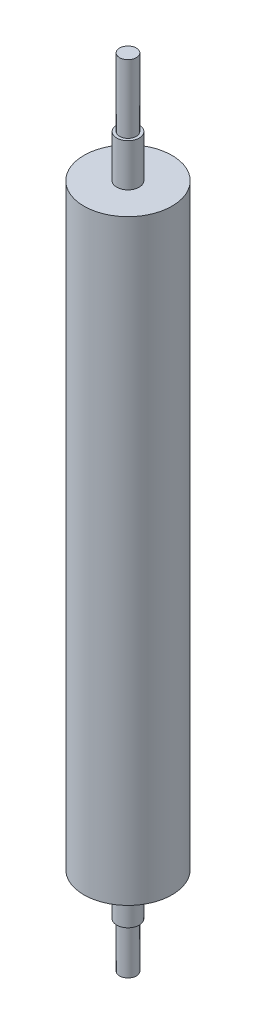
ISO-10303-21;
HEADER;
FILE_DESCRIPTION(('STEP AP214'),'2;1');
FILE_NAME('part.step','',(''),(''),'','','');
FILE_SCHEMA(('AUTOMOTIVE_DESIGN { 1 0 10303 214 1 1 1 1 }'));
ENDSEC;
DATA;
#1=APPLICATION_CONTEXT('core data for automotive mechanical design processes');
#2=APPLICATION_PROTOCOL_DEFINITION('international standard','automotive_design',2000,#1);
#3=PRODUCT_CONTEXT('',#1,'mechanical');
#4=PRODUCT('Part','Part','',(#3));
#5=PRODUCT_RELATED_PRODUCT_CATEGORY('part','',(#4));
#6=PRODUCT_DEFINITION_FORMATION('','',#4);
#7=PRODUCT_DEFINITION_CONTEXT('part definition',#1,'design');
#8=PRODUCT_DEFINITION('design','',#6,#7);
#9=PRODUCT_DEFINITION_SHAPE('','',#8);
#10=(LENGTH_UNIT() NAMED_UNIT(*) SI_UNIT(.MILLI.,.METRE.));
#11=(NAMED_UNIT(*) PLANE_ANGLE_UNIT() SI_UNIT($,.RADIAN.));
#12=(NAMED_UNIT(*) SI_UNIT($,.STERADIAN.) SOLID_ANGLE_UNIT());
#13=UNCERTAINTY_MEASURE_WITH_UNIT(LENGTH_MEASURE(1.E-05),#10,'distance_accuracy_value','');
#14=(GEOMETRIC_REPRESENTATION_CONTEXT(3) GLOBAL_UNCERTAINTY_ASSIGNED_CONTEXT((#13)) GLOBAL_UNIT_ASSIGNED_CONTEXT((#10,
#11,#12)) REPRESENTATION_CONTEXT('',''));
#15=CARTESIAN_POINT('',(0.,0.,0.));
#16=DIRECTION('',(0.,0.,1.));
#17=DIRECTION('',(1.,0.,0.));
#18=AXIS2_PLACEMENT_3D('',#15,#16,#17);
#19=CARTESIAN_POINT('',(0.,210.,0.));
#20=DIRECTION('',(0.,-1.,0.));
#21=DIRECTION('',(0.,0.,-1.));
#22=AXIS2_PLACEMENT_3D('',#19,#20,#21);
#23=CYLINDRICAL_SURFACE('',#22,15.5);
#24=CARTESIAN_POINT('',(0.,210.,0.));
#25=DIRECTION('',(0.,1.,0.));
#26=DIRECTION('',(0.,0.,1.));
#27=AXIS2_PLACEMENT_3D('',#24,#25,#26);
#28=CIRCLE('',#27,15.5);
#29=CARTESIAN_POINT('',(0.,210.,15.5));
#30=VERTEX_POINT('',#29);
#31=EDGE_CURVE('E47',#30,#30,#28,.T.);
#32=ORIENTED_EDGE('',*,*,#31,.F.);
#33=EDGE_LOOP('',(#32));
#34=FACE_BOUND('',#33,.T.);
#35=CARTESIAN_POINT('',(0.,0.,0.));
#36=DIRECTION('',(0.,1.,0.));
#37=DIRECTION('',(0.,0.,1.));
#38=AXIS2_PLACEMENT_3D('',#35,#36,#37);
#39=CIRCLE('',#38,15.5);
#40=CARTESIAN_POINT('',(0.,0.,15.5));
#41=VERTEX_POINT('',#40);
#42=EDGE_CURVE('E38',#41,#41,#39,.T.);
#43=ORIENTED_EDGE('',*,*,#42,.T.);
#44=EDGE_LOOP('',(#43));
#45=FACE_BOUND('',#44,.T.);
#46=ADVANCED_FACE('F35',(#34,#45),#23,.T.);
#47=CARTESIAN_POINT('',(0.,210.,0.));
#48=DIRECTION('',(0.,1.,0.));
#49=DIRECTION('',(0.,0.,1.));
#50=AXIS2_PLACEMENT_3D('',#47,#48,#49);
#51=PLANE('',#50);
#52=CARTESIAN_POINT('',(0.,210.,0.));
#53=DIRECTION('',(0.,1.,0.));
#54=DIRECTION('',(0.,0.,1.));
#55=AXIS2_PLACEMENT_3D('',#52,#53,#54);
#56=CIRCLE('',#55,3.95);
#57=CARTESIAN_POINT('',(0.,210.,3.95));
#58=VERTEX_POINT('',#57);
#59=EDGE_CURVE('E42',#58,#58,#56,.T.);
#60=ORIENTED_EDGE('',*,*,#59,.F.);
#61=EDGE_LOOP('',(#60));
#62=FACE_BOUND('',#61,.T.);
#63=ORIENTED_EDGE('',*,*,#31,.T.);
#64=EDGE_LOOP('',(#63));
#65=FACE_BOUND('',#64,.T.);
#66=ADVANCED_FACE('F76',(#62,#65),#51,.T.);
#67=CARTESIAN_POINT('',(0.,0.,0.));
#68=DIRECTION('',(0.,1.,0.));
#69=DIRECTION('',(0.,0.,1.));
#70=AXIS2_PLACEMENT_3D('',#67,#68,#69);
#71=PLANE('',#70);
#72=CARTESIAN_POINT('',(0.,0.,0.));
#73=DIRECTION('',(0.,1.,0.));
#74=DIRECTION('',(0.,0.,1.));
#75=AXIS2_PLACEMENT_3D('',#72,#73,#74);
#76=CIRCLE('',#75,3.95);
#77=CARTESIAN_POINT('',(0.,0.,3.95));
#78=VERTEX_POINT('',#77);
#79=EDGE_CURVE('E59',#78,#78,#76,.T.);
#80=ORIENTED_EDGE('',*,*,#79,.T.);
#81=EDGE_LOOP('',(#80));
#82=FACE_BOUND('',#81,.T.);
#83=ORIENTED_EDGE('',*,*,#42,.F.);
#84=EDGE_LOOP('',(#83));
#85=FACE_BOUND('',#84,.T.);
#86=ADVANCED_FACE('F73',(#82,#85),#71,.F.);
#87=CARTESIAN_POINT('',(0.,-15.,0.));
#88=DIRECTION('',(0.,1.,0.));
#89=DIRECTION('',(0.,0.,1.));
#90=AXIS2_PLACEMENT_3D('',#87,#88,#89);
#91=CYLINDRICAL_SURFACE('',#90,3.95);
#92=CARTESIAN_POINT('',(0.,-15.,0.));
#93=DIRECTION('',(0.,1.,0.));
#94=DIRECTION('',(0.,0.,1.));
#95=AXIS2_PLACEMENT_3D('',#92,#93,#94);
#96=CIRCLE('',#95,3.95);
#97=CARTESIAN_POINT('',(0.,-15.,3.95));
#98=VERTEX_POINT('',#97);
#99=EDGE_CURVE('E62',#98,#98,#96,.T.);
#100=ORIENTED_EDGE('',*,*,#99,.T.);
#101=EDGE_LOOP('',(#100));
#102=FACE_BOUND('',#101,.T.);
#103=ORIENTED_EDGE('',*,*,#79,.F.);
#104=EDGE_LOOP('',(#103));
#105=FACE_BOUND('',#104,.T.);
#106=ADVANCED_FACE('F75',(#102,#105),#91,.T.);
#107=CARTESIAN_POINT('',(0.,-15.,0.));
#108=DIRECTION('',(0.,1.,0.));
#109=DIRECTION('',(0.,0.,1.));
#110=AXIS2_PLACEMENT_3D('',#107,#108,#109);
#111=PLANE('',#110);
#112=CARTESIAN_POINT('',(0.,-15.,0.));
#113=DIRECTION('',(0.,1.,0.));
#114=DIRECTION('',(0.,0.,1.));
#115=AXIS2_PLACEMENT_3D('',#112,#113,#114);
#116=CIRCLE('',#115,2.95);
#117=CARTESIAN_POINT('',(0.,-15.,2.95));
#118=VERTEX_POINT('',#117);
#119=EDGE_CURVE('E54',#118,#118,#116,.T.);
#120=ORIENTED_EDGE('',*,*,#119,.T.);
#121=EDGE_LOOP('',(#120));
#122=FACE_BOUND('',#121,.T.);
#123=ORIENTED_EDGE('',*,*,#99,.F.);
#124=EDGE_LOOP('',(#123));
#125=FACE_BOUND('',#124,.T.);
#126=ADVANCED_FACE('F82',(#122,#125),#111,.F.);
#127=CARTESIAN_POINT('',(0.,-31.,0.));
#128=DIRECTION('',(0.,1.,0.));
#129=DIRECTION('',(0.,0.,1.));
#130=AXIS2_PLACEMENT_3D('',#127,#128,#129);
#131=CYLINDRICAL_SURFACE('',#130,2.95);
#132=CARTESIAN_POINT('',(0.,-31.,0.));
#133=DIRECTION('',(0.,1.,0.));
#134=DIRECTION('',(0.,0.,1.));
#135=AXIS2_PLACEMENT_3D('',#132,#133,#134);
#136=CIRCLE('',#135,2.95);
#137=CARTESIAN_POINT('',(0.,-31.,2.95));
#138=VERTEX_POINT('',#137);
#139=EDGE_CURVE('E56',#138,#138,#136,.T.);
#140=ORIENTED_EDGE('',*,*,#139,.T.);
#141=EDGE_LOOP('',(#140));
#142=FACE_BOUND('',#141,.T.);
#143=ORIENTED_EDGE('',*,*,#119,.F.);
#144=EDGE_LOOP('',(#143));
#145=FACE_BOUND('',#144,.T.);
#146=ADVANCED_FACE('F149',(#142,#145),#131,.T.);
#147=CARTESIAN_POINT('',(0.,-31.,0.));
#148=DIRECTION('',(0.,1.,0.));
#149=DIRECTION('',(0.,0.,1.));
#150=AXIS2_PLACEMENT_3D('',#147,#148,#149);
#151=PLANE('',#150);
#152=ORIENTED_EDGE('',*,*,#139,.F.);
#153=EDGE_LOOP('',(#152));
#154=FACE_BOUND('',#153,.T.);
#155=ADVANCED_FACE('F102',(#154),#151,.F.);
#156=CARTESIAN_POINT('',(0.,225.,0.));
#157=DIRECTION('',(0.,-1.,0.));
#158=DIRECTION('',(0.,0.,-1.));
#159=AXIS2_PLACEMENT_3D('',#156,#157,#158);
#160=CYLINDRICAL_SURFACE('',#159,3.95);
#161=CARTESIAN_POINT('',(0.,225.,0.));
#162=DIRECTION('',(0.,1.,0.));
#163=DIRECTION('',(0.,0.,1.));
#164=AXIS2_PLACEMENT_3D('',#161,#162,#163);
#165=CIRCLE('',#164,3.95);
#166=CARTESIAN_POINT('',(0.,225.,3.95));
#167=VERTEX_POINT('',#166);
#168=EDGE_CURVE('E52',#167,#167,#165,.T.);
#169=ORIENTED_EDGE('',*,*,#168,.F.);
#170=EDGE_LOOP('',(#169));
#171=FACE_BOUND('',#170,.T.);
#172=ORIENTED_EDGE('',*,*,#59,.T.);
#173=EDGE_LOOP('',(#172));
#174=FACE_BOUND('',#173,.T.);
#175=ADVANCED_FACE('F107',(#171,#174),#160,.T.);
#176=CARTESIAN_POINT('',(0.,225.,0.));
#177=DIRECTION('',(0.,1.,0.));
#178=DIRECTION('',(0.,0.,1.));
#179=AXIS2_PLACEMENT_3D('',#176,#177,#178);
#180=PLANE('',#179);
#181=CARTESIAN_POINT('',(0.,225.,0.));
#182=DIRECTION('',(0.,1.,0.));
#183=DIRECTION('',(0.,0.,1.));
#184=AXIS2_PLACEMENT_3D('',#181,#182,#183);
#185=CIRCLE('',#184,2.95);
#186=CARTESIAN_POINT('',(0.,225.,2.95));
#187=VERTEX_POINT('',#186);
#188=EDGE_CURVE('E10',#187,#187,#185,.T.);
#189=ORIENTED_EDGE('',*,*,#188,.F.);
#190=EDGE_LOOP('',(#189));
#191=FACE_BOUND('',#190,.T.);
#192=ORIENTED_EDGE('',*,*,#168,.T.);
#193=EDGE_LOOP('',(#192));
#194=FACE_BOUND('',#193,.T.);
#195=ADVANCED_FACE('F112',(#191,#194),#180,.T.);
#196=CARTESIAN_POINT('',(0.,249.,0.));
#197=DIRECTION('',(0.,-1.,0.));
#198=DIRECTION('',(0.,0.,-1.));
#199=AXIS2_PLACEMENT_3D('',#196,#197,#198);
#200=CYLINDRICAL_SURFACE('',#199,2.95);
#201=CARTESIAN_POINT('',(0.,249.,0.));
#202=DIRECTION('',(0.,1.,0.));
#203=DIRECTION('',(0.,0.,1.));
#204=AXIS2_PLACEMENT_3D('',#201,#202,#203);
#205=CIRCLE('',#204,2.95);
#206=CARTESIAN_POINT('',(0.,249.,2.95));
#207=VERTEX_POINT('',#206);
#208=EDGE_CURVE('E51',#207,#207,#205,.T.);
#209=ORIENTED_EDGE('',*,*,#208,.F.);
#210=EDGE_LOOP('',(#209));
#211=FACE_BOUND('',#210,.T.);
#212=ORIENTED_EDGE('',*,*,#188,.T.);
#213=EDGE_LOOP('',(#212));
#214=FACE_BOUND('',#213,.T.);
#215=ADVANCED_FACE('F122',(#211,#214),#200,.T.);
#216=CARTESIAN_POINT('',(0.,249.,0.));
#217=DIRECTION('',(0.,1.,0.));
#218=DIRECTION('',(0.,0.,1.));
#219=AXIS2_PLACEMENT_3D('',#216,#217,#218);
#220=PLANE('',#219);
#221=ORIENTED_EDGE('',*,*,#208,.T.);
#222=EDGE_LOOP('',(#221));
#223=FACE_BOUND('',#222,.T.);
#224=ADVANCED_FACE('F132',(#223),#220,.T.);
#225=CLOSED_SHELL('',(#46,#66,#86,#106,#126,#146,#155,#175,#195,#215,#224));
#226=MANIFOLD_SOLID_BREP('B2',#225);
#227=ADVANCED_BREP_SHAPE_REPRESENTATION('',(#18,#226),#14);
#228=SHAPE_DEFINITION_REPRESENTATION(#9,#227);
ENDSEC;
END-ISO-10303-21;
